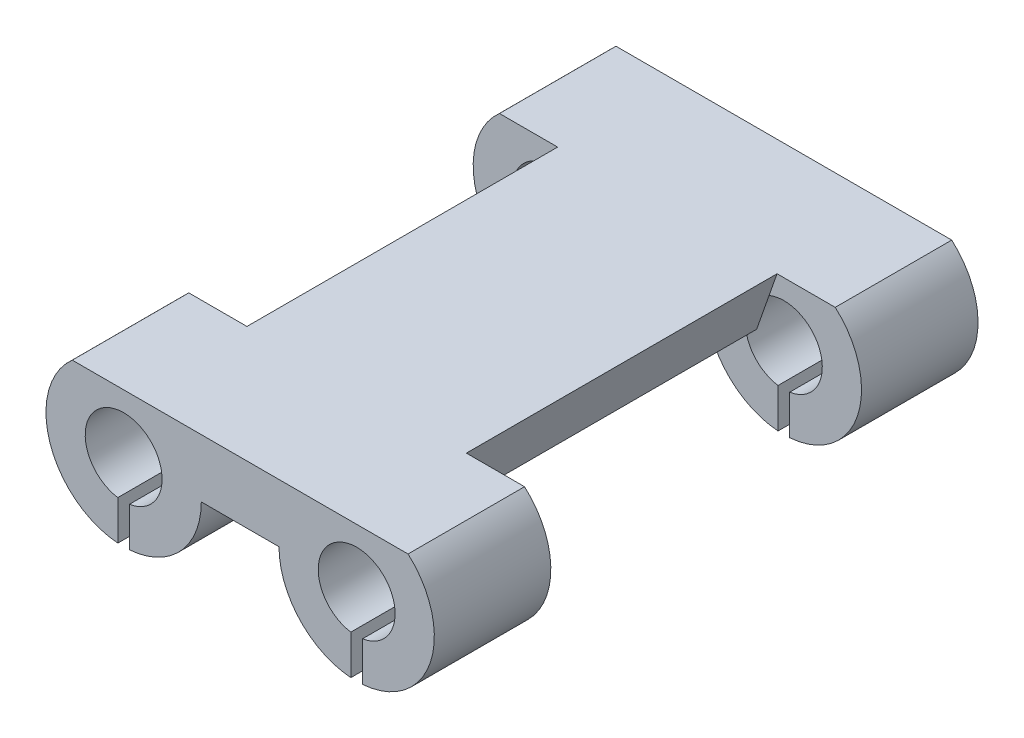
ISO-10303-21;
HEADER;
FILE_DESCRIPTION(('STEP AP214'),'2;1');
FILE_NAME('part.step','',(''),(''),'','','');
FILE_SCHEMA(('AUTOMOTIVE_DESIGN { 1 0 10303 214 1 1 1 1 }'));
ENDSEC;
DATA;
#1=APPLICATION_CONTEXT('core data for automotive mechanical design processes');
#2=APPLICATION_PROTOCOL_DEFINITION('international standard','automotive_design',2000,#1);
#3=PRODUCT_CONTEXT('',#1,'mechanical');
#4=PRODUCT('Part','Part','',(#3));
#5=PRODUCT_RELATED_PRODUCT_CATEGORY('part','',(#4));
#6=PRODUCT_DEFINITION_FORMATION('','',#4);
#7=PRODUCT_DEFINITION_CONTEXT('part definition',#1,'design');
#8=PRODUCT_DEFINITION('design','',#6,#7);
#9=PRODUCT_DEFINITION_SHAPE('','',#8);
#10=(LENGTH_UNIT() NAMED_UNIT(*) SI_UNIT(.MILLI.,.METRE.));
#11=(NAMED_UNIT(*) PLANE_ANGLE_UNIT() SI_UNIT($,.RADIAN.));
#12=(NAMED_UNIT(*) SI_UNIT($,.STERADIAN.) SOLID_ANGLE_UNIT());
#13=UNCERTAINTY_MEASURE_WITH_UNIT(LENGTH_MEASURE(1.E-05),#10,'distance_accuracy_value','');
#14=(GEOMETRIC_REPRESENTATION_CONTEXT(3) GLOBAL_UNCERTAINTY_ASSIGNED_CONTEXT((#13)) GLOBAL_UNIT_ASSIGNED_CONTEXT((#10,
#11,#12)) REPRESENTATION_CONTEXT('',''));
#15=CARTESIAN_POINT('',(0.,0.,0.));
#16=DIRECTION('',(0.,0.,1.));
#17=DIRECTION('',(1.,0.,0.));
#18=AXIS2_PLACEMENT_3D('',#15,#16,#17);
#19=CARTESIAN_POINT('',(15.,0.,15.));
#20=DIRECTION('',(0.,0.,1.));
#21=DIRECTION('',(1.,0.,0.));
#22=AXIS2_PLACEMENT_3D('',#19,#20,#21);
#23=PLANE('',#22);
#24=DIRECTION('',(0.,-1.,0.));
#25=VECTOR('',#24,1.);
#26=CARTESIAN_POINT('',(14.25,0.,15.));
#27=LINE('',#26,#25);
#28=CARTESIAN_POINT('',(14.25,-4.89285192909003,15.));
#29=VERTEX_POINT('',#28);
#30=CARTESIAN_POINT('',(14.25,-9.97183533758956,15.));
#31=VERTEX_POINT('',#30);
#32=EDGE_CURVE('E390',#29,#31,#27,.T.);
#33=ORIENTED_EDGE('',*,*,#32,.F.);
#34=CARTESIAN_POINT('',(15.,0.,15.));
#35=DIRECTION('',(0.,0.,-1.));
#36=DIRECTION('',(-1.,0.,0.));
#37=AXIS2_PLACEMENT_3D('',#34,#35,#36);
#38=CIRCLE('',#37,4.95);
#39=CARTESIAN_POINT('',(10.05,0.,15.));
#40=VERTEX_POINT('',#39);
#41=EDGE_CURVE('E459',#29,#40,#38,.T.);
#42=ORIENTED_EDGE('',*,*,#41,.T.);
#43=DIRECTION('',(1.,0.,0.));
#44=VECTOR('',#43,1.);
#45=CARTESIAN_POINT('',(11.5,0.,15.));
#46=LINE('',#45,#44);
#47=CARTESIAN_POINT('',(5.,0.,15.));
#48=VERTEX_POINT('',#47);
#49=EDGE_CURVE('E278',#48,#40,#46,.T.);
#50=ORIENTED_EDGE('',*,*,#49,.F.);
#51=CARTESIAN_POINT('',(15.,0.,15.));
#52=DIRECTION('',(0.,0.,1.));
#53=DIRECTION('',(1.,0.,0.));
#54=AXIS2_PLACEMENT_3D('',#51,#52,#53);
#55=CIRCLE('',#54,10.);
#56=EDGE_CURVE('E366',#48,#31,#55,.T.);
#57=ORIENTED_EDGE('',*,*,#56,.T.);
#58=EDGE_LOOP('',(#33,#42,#50,#57));
#59=FACE_BOUND('',#58,.T.);
#60=ADVANCED_FACE('F32',(#59),#23,.T.);
#61=CARTESIAN_POINT('',(15.,0.,15.));
#62=DIRECTION('',(0.,0.,-1.));
#63=DIRECTION('',(-1.,0.,0.));
#64=AXIS2_PLACEMENT_3D('',#61,#62,#63);
#65=CYLINDRICAL_SURFACE('',#64,10.);
#66=CARTESIAN_POINT('',(15.,0.,0.));
#67=DIRECTION('',(0.,0.,1.));
#68=DIRECTION('',(1.,0.,0.));
#69=AXIS2_PLACEMENT_3D('',#66,#67,#68);
#70=CIRCLE('',#69,10.);
#71=CARTESIAN_POINT('',(5.,0.,0.));
#72=VERTEX_POINT('',#71);
#73=CARTESIAN_POINT('',(14.25,-9.97183533758956,0.));
#74=VERTEX_POINT('',#73);
#75=EDGE_CURVE('E268',#72,#74,#70,.T.);
#76=ORIENTED_EDGE('',*,*,#75,.T.);
#77=DIRECTION('',(0.,0.,-1.));
#78=VECTOR('',#77,1.);
#79=CARTESIAN_POINT('',(14.25,-9.97183533758956,15.));
#80=LINE('',#79,#78);
#81=EDGE_CURVE('E394',#74,#31,#80,.F.);
#82=ORIENTED_EDGE('',*,*,#81,.T.);
#83=ORIENTED_EDGE('',*,*,#56,.F.);
#84=DIRECTION('',(0.,0.,-1.));
#85=VECTOR('',#84,1.);
#86=CARTESIAN_POINT('',(5.,0.,15.));
#87=LINE('',#86,#85);
#88=EDGE_CURVE('E376',#48,#72,#87,.T.);
#89=ORIENTED_EDGE('',*,*,#88,.T.);
#90=EDGE_LOOP('',(#76,#82,#83,#89));
#91=FACE_BOUND('',#90,.T.);
#92=ADVANCED_FACE('F393',(#91),#65,.T.);
#93=CARTESIAN_POINT('',(15.,0.,55.));
#94=DIRECTION('',(0.,0.,1.));
#95=DIRECTION('',(1.,0.,0.));
#96=AXIS2_PLACEMENT_3D('',#93,#94,#95);
#97=PLANE('',#96);
#98=CARTESIAN_POINT('',(15.,0.,55.));
#99=DIRECTION('',(0.,0.,1.));
#100=DIRECTION('',(1.,0.,0.));
#101=AXIS2_PLACEMENT_3D('',#98,#99,#100);
#102=CIRCLE('',#101,4.95);
#103=CARTESIAN_POINT('',(10.05,0.,55.));
#104=VERTEX_POINT('',#103);
#105=CARTESIAN_POINT('',(14.25,-4.89285192909003,55.));
#106=VERTEX_POINT('',#105);
#107=EDGE_CURVE('E443',#104,#106,#102,.T.);
#108=ORIENTED_EDGE('',*,*,#107,.T.);
#109=DIRECTION('',(0.,-1.,0.));
#110=VECTOR('',#109,1.);
#111=CARTESIAN_POINT('',(14.25,0.,55.));
#112=LINE('',#111,#110);
#113=CARTESIAN_POINT('',(14.25,-9.97183533758956,55.));
#114=VERTEX_POINT('',#113);
#115=EDGE_CURVE('E530',#106,#114,#112,.T.);
#116=ORIENTED_EDGE('',*,*,#115,.T.);
#117=CARTESIAN_POINT('',(15.,0.,55.));
#118=DIRECTION('',(0.,0.,1.));
#119=DIRECTION('',(1.,0.,0.));
#120=AXIS2_PLACEMENT_3D('',#117,#118,#119);
#121=CIRCLE('',#120,10.);
#122=CARTESIAN_POINT('',(5.,0.,55.));
#123=VERTEX_POINT('',#122);
#124=EDGE_CURVE('E924',#123,#114,#121,.T.);
#125=ORIENTED_EDGE('',*,*,#124,.F.);
#126=DIRECTION('',(1.,0.,0.));
#127=VECTOR('',#126,1.);
#128=CARTESIAN_POINT('',(11.5,0.,55.));
#129=LINE('',#128,#127);
#130=EDGE_CURVE('E328',#123,#104,#129,.T.);
#131=ORIENTED_EDGE('',*,*,#130,.T.);
#132=EDGE_LOOP('',(#108,#116,#125,#131));
#133=FACE_BOUND('',#132,.T.);
#134=ADVANCED_FACE('F588',(#133),#97,.F.);
#135=CARTESIAN_POINT('',(15.,0.,70.));
#136=DIRECTION('',(0.,0.,-1.));
#137=DIRECTION('',(-1.,0.,0.));
#138=AXIS2_PLACEMENT_3D('',#135,#136,#137);
#139=CYLINDRICAL_SURFACE('',#138,10.);
#140=ORIENTED_EDGE('',*,*,#124,.T.);
#141=DIRECTION('',(0.,0.,-1.));
#142=VECTOR('',#141,1.);
#143=CARTESIAN_POINT('',(14.25,-9.97183533758956,70.));
#144=LINE('',#143,#142);
#145=CARTESIAN_POINT('',(14.25,-9.97183533758956,70.));
#146=VERTEX_POINT('',#145);
#147=EDGE_CURVE('E533',#114,#146,#144,.F.);
#148=ORIENTED_EDGE('',*,*,#147,.T.);
#149=CARTESIAN_POINT('',(15.,0.,70.));
#150=DIRECTION('',(0.,0.,1.));
#151=DIRECTION('',(1.,0.,0.));
#152=AXIS2_PLACEMENT_3D('',#149,#150,#151);
#153=CIRCLE('',#152,10.);
#154=CARTESIAN_POINT('',(5.,0.,70.));
#155=VERTEX_POINT('',#154);
#156=EDGE_CURVE('E476',#155,#146,#153,.T.);
#157=ORIENTED_EDGE('',*,*,#156,.F.);
#158=DIRECTION('',(0.,0.,-1.));
#159=VECTOR('',#158,1.);
#160=CARTESIAN_POINT('',(5.,0.,70.));
#161=LINE('',#160,#159);
#162=EDGE_CURVE('E478',#155,#123,#161,.T.);
#163=ORIENTED_EDGE('',*,*,#162,.T.);
#164=EDGE_LOOP('',(#140,#148,#157,#163));
#165=FACE_BOUND('',#164,.T.);
#166=ADVANCED_FACE('F583',(#165),#139,.T.);
#167=CARTESIAN_POINT('',(-15.,0.,15.));
#168=DIRECTION('',(0.,0.,-1.));
#169=DIRECTION('',(-1.,0.,0.));
#170=AXIS2_PLACEMENT_3D('',#167,#168,#169);
#171=CYLINDRICAL_SURFACE('',#170,10.);
#172=CARTESIAN_POINT('',(-15.,0.,15.));
#173=DIRECTION('',(0.,0.,1.));
#174=DIRECTION('',(1.,0.,0.));
#175=AXIS2_PLACEMENT_3D('',#172,#173,#174);
#176=CIRCLE('',#175,10.);
#177=CARTESIAN_POINT('',(-21.6143782776615,7.5,15.));
#178=VERTEX_POINT('',#177);
#179=CARTESIAN_POINT('',(-15.75,-9.97183533758957,15.));
#180=VERTEX_POINT('',#179);
#181=EDGE_CURVE('E36',#178,#180,#176,.T.);
#182=ORIENTED_EDGE('',*,*,#181,.F.);
#183=DIRECTION('',(0.,0.,-1.));
#184=VECTOR('',#183,1.);
#185=CARTESIAN_POINT('',(-21.6143782776615,7.5,15.));
#186=LINE('',#185,#184);
#187=CARTESIAN_POINT('',(-21.6143782776615,7.5,0.));
#188=VERTEX_POINT('',#187);
#189=EDGE_CURVE('E513',#178,#188,#186,.T.);
#190=ORIENTED_EDGE('',*,*,#189,.T.);
#191=CARTESIAN_POINT('',(-15.,0.,0.));
#192=DIRECTION('',(0.,0.,1.));
#193=DIRECTION('',(1.,0.,0.));
#194=AXIS2_PLACEMENT_3D('',#191,#192,#193);
#195=CIRCLE('',#194,10.);
#196=CARTESIAN_POINT('',(-15.75,-9.97183533758957,0.));
#197=VERTEX_POINT('',#196);
#198=EDGE_CURVE('E262',#188,#197,#195,.T.);
#199=ORIENTED_EDGE('',*,*,#198,.T.);
#200=DIRECTION('',(0.,0.,-1.));
#201=VECTOR('',#200,1.);
#202=CARTESIAN_POINT('',(-15.75,-9.97183533758957,15.));
#203=LINE('',#202,#201);
#204=EDGE_CURVE('E436',#197,#180,#203,.F.);
#205=ORIENTED_EDGE('',*,*,#204,.T.);
#206=EDGE_LOOP('',(#182,#190,#199,#205));
#207=FACE_BOUND('',#206,.T.);
#208=ADVANCED_FACE('F575',(#207),#171,.T.);
#209=DIRECTION('',(1.,0.,0.));
#210=VECTOR('',#209,1.);
#211=CARTESIAN_POINT('',(15.,7.49999999999999,15.));
#212=LINE('',#211,#210);
#213=CARTESIAN_POINT('',(-14.125,7.5,15.));
#214=VERTEX_POINT('',#213);
#215=EDGE_CURVE('E252',#178,#214,#212,.T.);
#216=ORIENTED_EDGE('',*,*,#215,.F.);
#217=ORIENTED_EDGE('',*,*,#181,.T.);
#218=DIRECTION('',(0.,-1.,0.));
#219=VECTOR('',#218,1.);
#220=CARTESIAN_POINT('',(-15.75,0.,15.));
#221=LINE('',#220,#219);
#222=CARTESIAN_POINT('',(-15.75,-4.89285192909003,15.));
#223=VERTEX_POINT('',#222);
#224=EDGE_CURVE('E433',#223,#180,#221,.T.);
#225=ORIENTED_EDGE('',*,*,#224,.F.);
#226=CARTESIAN_POINT('',(-15.,0.,15.));
#227=DIRECTION('',(0.,0.,-1.));
#228=DIRECTION('',(-1.,0.,0.));
#229=AXIS2_PLACEMENT_3D('',#226,#227,#228);
#230=CIRCLE('',#229,4.95);
#231=CARTESIAN_POINT('',(-13.0997554151948,4.57072975769936,15.));
#232=VERTEX_POINT('',#231);
#233=EDGE_CURVE('E468',#223,#232,#230,.T.);
#234=ORIENTED_EDGE('',*,*,#233,.T.);
#235=DIRECTION('',(0.330350424728109,-0.943858356366016,0.));
#236=VECTOR('',#235,1.);
#237=CARTESIAN_POINT('',(-11.5,0.,15.));
#238=LINE('',#237,#236);
#239=EDGE_CURVE('E318',#214,#232,#238,.T.);
#240=ORIENTED_EDGE('',*,*,#239,.F.);
#241=EDGE_LOOP('',(#216,#217,#225,#234,#240));
#242=FACE_BOUND('',#241,.T.);
#243=ADVANCED_FACE('F565',(#242),#23,.T.);
#244=CARTESIAN_POINT('',(-15.,0.,55.));
#245=DIRECTION('',(0.,0.,1.));
#246=DIRECTION('',(1.,0.,0.));
#247=AXIS2_PLACEMENT_3D('',#244,#245,#246);
#248=CIRCLE('',#247,10.);
#249=CARTESIAN_POINT('',(-21.6143782776615,7.5,55.));
#250=VERTEX_POINT('',#249);
#251=CARTESIAN_POINT('',(-15.75,-9.97183533758957,55.));
#252=VERTEX_POINT('',#251);
#253=EDGE_CURVE('E351',#250,#252,#248,.T.);
#254=ORIENTED_EDGE('',*,*,#253,.F.);
#255=DIRECTION('',(1.,0.,0.));
#256=VECTOR('',#255,1.);
#257=CARTESIAN_POINT('',(15.,7.49999999999999,55.));
#258=LINE('',#257,#256);
#259=CARTESIAN_POINT('',(-14.125,7.5,55.));
#260=VERTEX_POINT('',#259);
#261=EDGE_CURVE('E507',#250,#260,#258,.T.);
#262=ORIENTED_EDGE('',*,*,#261,.T.);
#263=DIRECTION('',(0.330350424728109,-0.943858356366016,0.));
#264=VECTOR('',#263,1.);
#265=CARTESIAN_POINT('',(-11.5,0.,55.));
#266=LINE('',#265,#264);
#267=CARTESIAN_POINT('',(-13.0997554151948,4.57072975769936,55.));
#268=VERTEX_POINT('',#267);
#269=EDGE_CURVE('E323',#260,#268,#266,.T.);
#270=ORIENTED_EDGE('',*,*,#269,.T.);
#271=CARTESIAN_POINT('',(-15.,0.,55.));
#272=DIRECTION('',(0.,0.,1.));
#273=DIRECTION('',(1.,0.,0.));
#274=AXIS2_PLACEMENT_3D('',#271,#272,#273);
#275=CIRCLE('',#274,4.95);
#276=CARTESIAN_POINT('',(-15.75,-4.89285192909003,55.));
#277=VERTEX_POINT('',#276);
#278=EDGE_CURVE('E451',#268,#277,#275,.T.);
#279=ORIENTED_EDGE('',*,*,#278,.T.);
#280=DIRECTION('',(0.,-1.,0.));
#281=VECTOR('',#280,1.);
#282=CARTESIAN_POINT('',(-15.75,0.,55.));
#283=LINE('',#282,#281);
#284=EDGE_CURVE('E422',#277,#252,#283,.T.);
#285=ORIENTED_EDGE('',*,*,#284,.T.);
#286=EDGE_LOOP('',(#254,#262,#270,#279,#285));
#287=FACE_BOUND('',#286,.T.);
#288=ADVANCED_FACE('F593',(#287),#97,.F.);
#289=CARTESIAN_POINT('',(-15.,0.,70.));
#290=DIRECTION('',(0.,0.,-1.));
#291=DIRECTION('',(-1.,0.,0.));
#292=AXIS2_PLACEMENT_3D('',#289,#290,#291);
#293=CYLINDRICAL_SURFACE('',#292,10.);
#294=CARTESIAN_POINT('',(-15.,0.,70.));
#295=DIRECTION('',(0.,0.,1.));
#296=DIRECTION('',(1.,0.,0.));
#297=AXIS2_PLACEMENT_3D('',#294,#295,#296);
#298=CIRCLE('',#297,10.);
#299=CARTESIAN_POINT('',(-21.6143782776615,7.5,70.));
#300=VERTEX_POINT('',#299);
#301=CARTESIAN_POINT('',(-15.75,-9.97183533758957,70.));
#302=VERTEX_POINT('',#301);
#303=EDGE_CURVE('E471',#300,#302,#298,.T.);
#304=ORIENTED_EDGE('',*,*,#303,.F.);
#305=DIRECTION('',(0.,0.,-1.));
#306=VECTOR('',#305,1.);
#307=CARTESIAN_POINT('',(-21.6143782776615,7.5,70.));
#308=LINE('',#307,#306);
#309=EDGE_CURVE('E49',#300,#250,#308,.T.);
#310=ORIENTED_EDGE('',*,*,#309,.T.);
#311=ORIENTED_EDGE('',*,*,#253,.T.);
#312=DIRECTION('',(0.,0.,-1.));
#313=VECTOR('',#312,1.);
#314=CARTESIAN_POINT('',(-15.75,-9.97183533758957,70.));
#315=LINE('',#314,#313);
#316=EDGE_CURVE('E425',#252,#302,#315,.F.);
#317=ORIENTED_EDGE('',*,*,#316,.T.);
#318=EDGE_LOOP('',(#304,#310,#311,#317));
#319=FACE_BOUND('',#318,.T.);
#320=ADVANCED_FACE('F580',(#319),#293,.T.);
#321=DIRECTION('',(1.,0.,0.));
#322=VECTOR('',#321,1.);
#323=CARTESIAN_POINT('',(15.,7.49999999999999,15.));
#324=LINE('',#323,#322);
#325=CARTESIAN_POINT('',(14.125,7.49999999999999,15.));
#326=VERTEX_POINT('',#325);
#327=CARTESIAN_POINT('',(21.6143782776615,7.49999999999999,15.));
#328=VERTEX_POINT('',#327);
#329=EDGE_CURVE('E247',#326,#328,#324,.T.);
#330=ORIENTED_EDGE('',*,*,#329,.F.);
#331=DIRECTION('',(0.330350424728106,0.943858356366017,0.));
#332=VECTOR('',#331,1.);
#333=CARTESIAN_POINT('',(15.,10.,15.));
#334=LINE('',#333,#332);
#335=CARTESIAN_POINT('',(13.0997554151948,4.57072975769936,15.));
#336=VERTEX_POINT('',#335);
#337=EDGE_CURVE('E287',#336,#326,#334,.T.);
#338=ORIENTED_EDGE('',*,*,#337,.F.);
#339=CARTESIAN_POINT('',(15.75,-4.89285192909003,15.));
#340=VERTEX_POINT('',#339);
#341=EDGE_CURVE('E458',#336,#340,#38,.T.);
#342=ORIENTED_EDGE('',*,*,#341,.T.);
#343=DIRECTION('',(0.,1.,0.));
#344=VECTOR('',#343,1.);
#345=CARTESIAN_POINT('',(15.75,0.,15.));
#346=LINE('',#345,#344);
#347=CARTESIAN_POINT('',(15.75,-9.97183533758956,15.));
#348=VERTEX_POINT('',#347);
#349=EDGE_CURVE('E528',#348,#340,#346,.T.);
#350=ORIENTED_EDGE('',*,*,#349,.F.);
#351=EDGE_CURVE('E363',#348,#328,#55,.T.);
#352=ORIENTED_EDGE('',*,*,#351,.T.);
#353=EDGE_LOOP('',(#330,#338,#342,#350,#352));
#354=FACE_BOUND('',#353,.T.);
#355=ADVANCED_FACE('F546',(#354),#23,.T.);
#356=CARTESIAN_POINT('',(-14.25,-9.97183533758957,15.));
#357=VERTEX_POINT('',#356);
#358=CARTESIAN_POINT('',(-5.,0.,15.));
#359=VERTEX_POINT('',#358);
#360=EDGE_CURVE('E272',#357,#359,#176,.T.);
#361=ORIENTED_EDGE('',*,*,#360,.F.);
#362=DIRECTION('',(0.,0.,-1.));
#363=VECTOR('',#362,1.);
#364=CARTESIAN_POINT('',(-14.25,-9.97183533758957,15.));
#365=LINE('',#364,#363);
#366=CARTESIAN_POINT('',(-14.25,-9.97183533758957,0.));
#367=VERTEX_POINT('',#366);
#368=EDGE_CURVE('E420',#357,#367,#365,.T.);
#369=ORIENTED_EDGE('',*,*,#368,.T.);
#370=CARTESIAN_POINT('',(-5.,0.,0.));
#371=VERTEX_POINT('',#370);
#372=EDGE_CURVE('E291',#367,#371,#195,.T.);
#373=ORIENTED_EDGE('',*,*,#372,.T.);
#374=DIRECTION('',(0.,0.,-1.));
#375=VECTOR('',#374,1.);
#376=CARTESIAN_POINT('',(-5.,0.,15.));
#377=LINE('',#376,#375);
#378=EDGE_CURVE('E374',#359,#371,#377,.T.);
#379=ORIENTED_EDGE('',*,*,#378,.F.);
#380=EDGE_LOOP('',(#361,#369,#373,#379));
#381=FACE_BOUND('',#380,.T.);
#382=ADVANCED_FACE('F34',(#381),#171,.T.);
#383=CARTESIAN_POINT('',(-5.,0.,15.));
#384=DIRECTION('',(0.,1.,0.));
#385=DIRECTION('',(0.,0.,1.));
#386=AXIS2_PLACEMENT_3D('',#383,#384,#385);
#387=PLANE('',#386);
#388=DIRECTION('',(1.,0.,0.));
#389=VECTOR('',#388,1.);
#390=CARTESIAN_POINT('',(-5.,0.,0.));
#391=LINE('',#390,#389);
#392=EDGE_CURVE('E269',#371,#72,#391,.T.);
#393=ORIENTED_EDGE('',*,*,#392,.T.);
#394=ORIENTED_EDGE('',*,*,#88,.F.);
#395=ORIENTED_EDGE('',*,*,#49,.T.);
#396=DIRECTION('',(-1.,0.,0.));
#397=VECTOR('',#396,1.);
#398=CARTESIAN_POINT('',(-5.,0.,15.));
#399=LINE('',#398,#397);
#400=CARTESIAN_POINT('',(11.5,0.,15.));
#401=VERTEX_POINT('',#400);
#402=EDGE_CURVE('E457',#401,#40,#399,.T.);
#403=ORIENTED_EDGE('',*,*,#402,.F.);
#404=DIRECTION('',(0.,0.,-1.));
#405=VECTOR('',#404,1.);
#406=CARTESIAN_POINT('',(11.5,0.,55.));
#407=LINE('',#406,#405);
#408=CARTESIAN_POINT('',(11.5,0.,55.));
#409=VERTEX_POINT('',#408);
#410=EDGE_CURVE('E301',#409,#401,#407,.T.);
#411=ORIENTED_EDGE('',*,*,#410,.F.);
#412=EDGE_CURVE('E339',#104,#409,#129,.T.);
#413=ORIENTED_EDGE('',*,*,#412,.F.);
#414=ORIENTED_EDGE('',*,*,#130,.F.);
#415=ORIENTED_EDGE('',*,*,#162,.F.);
#416=DIRECTION('',(1.,0.,0.));
#417=VECTOR('',#416,1.);
#418=CARTESIAN_POINT('',(-5.,0.,70.));
#419=LINE('',#418,#417);
#420=CARTESIAN_POINT('',(-5.,0.,70.));
#421=VERTEX_POINT('',#420);
#422=EDGE_CURVE('E473',#421,#155,#419,.T.);
#423=ORIENTED_EDGE('',*,*,#422,.F.);
#424=DIRECTION('',(0.,0.,-1.));
#425=VECTOR('',#424,1.);
#426=CARTESIAN_POINT('',(-5.,0.,70.));
#427=LINE('',#426,#425);
#428=CARTESIAN_POINT('',(-5.,0.,55.));
#429=VERTEX_POINT('',#428);
#430=EDGE_CURVE('E359',#421,#429,#427,.T.);
#431=ORIENTED_EDGE('',*,*,#430,.T.);
#432=CARTESIAN_POINT('',(-10.05,0.,55.));
#433=VERTEX_POINT('',#432);
#434=EDGE_CURVE('E336',#433,#429,#129,.T.);
#435=ORIENTED_EDGE('',*,*,#434,.F.);
#436=CARTESIAN_POINT('',(-11.5,0.,55.));
#437=VERTEX_POINT('',#436);
#438=EDGE_CURVE('E333',#437,#433,#129,.T.);
#439=ORIENTED_EDGE('',*,*,#438,.F.);
#440=DIRECTION('',(0.,0.,-1.));
#441=VECTOR('',#440,1.);
#442=CARTESIAN_POINT('',(-11.5,0.,55.));
#443=LINE('',#442,#441);
#444=CARTESIAN_POINT('',(-11.5,0.,15.));
#445=VERTEX_POINT('',#444);
#446=EDGE_CURVE('E289',#437,#445,#443,.T.);
#447=ORIENTED_EDGE('',*,*,#446,.T.);
#448=CARTESIAN_POINT('',(-10.05,0.,15.));
#449=VERTEX_POINT('',#448);
#450=EDGE_CURVE('E284',#445,#449,#46,.T.);
#451=ORIENTED_EDGE('',*,*,#450,.T.);
#452=EDGE_CURVE('E288',#449,#359,#46,.T.);
#453=ORIENTED_EDGE('',*,*,#452,.T.);
#454=ORIENTED_EDGE('',*,*,#378,.T.);
#455=EDGE_LOOP('',(#393,#394,#395,#403,#411,#413,#414,#415,#423,#431,#435,#439,#447,#451,#453,#454));
#456=FACE_BOUND('',#455,.T.);
#457=ADVANCED_FACE('F551',(#456),#387,.F.);
#458=CARTESIAN_POINT('',(15.75,-9.97183533758956,0.));
#459=VERTEX_POINT('',#458);
#460=CARTESIAN_POINT('',(21.6143782776615,7.49999999999999,0.));
#461=VERTEX_POINT('',#460);
#462=EDGE_CURVE('E260',#459,#461,#70,.T.);
#463=ORIENTED_EDGE('',*,*,#462,.T.);
#464=DIRECTION('',(0.,0.,-1.));
#465=VECTOR('',#464,1.);
#466=CARTESIAN_POINT('',(21.6143782776615,7.49999999999999,15.));
#467=LINE('',#466,#465);
#468=EDGE_CURVE('E241',#461,#328,#467,.F.);
#469=ORIENTED_EDGE('',*,*,#468,.T.);
#470=ORIENTED_EDGE('',*,*,#351,.F.);
#471=DIRECTION('',(0.,0.,-1.));
#472=VECTOR('',#471,1.);
#473=CARTESIAN_POINT('',(15.75,-9.97183533758956,15.));
#474=LINE('',#473,#472);
#475=EDGE_CURVE('E267',#348,#459,#474,.T.);
#476=ORIENTED_EDGE('',*,*,#475,.T.);
#477=EDGE_LOOP('',(#463,#469,#470,#476));
#478=FACE_BOUND('',#477,.T.);
#479=ADVANCED_FACE('F266',(#478),#65,.T.);
#480=DIRECTION('',(0.,1.,0.));
#481=VECTOR('',#480,1.);
#482=CARTESIAN_POINT('',(-14.25,0.,15.));
#483=LINE('',#482,#481);
#484=CARTESIAN_POINT('',(-14.25,-4.89285192909003,15.));
#485=VERTEX_POINT('',#484);
#486=EDGE_CURVE('E418',#357,#485,#483,.T.);
#487=ORIENTED_EDGE('',*,*,#486,.F.);
#488=ORIENTED_EDGE('',*,*,#360,.T.);
#489=ORIENTED_EDGE('',*,*,#452,.F.);
#490=EDGE_CURVE('E467',#449,#485,#230,.T.);
#491=ORIENTED_EDGE('',*,*,#490,.T.);
#492=EDGE_LOOP('',(#487,#488,#489,#491));
#493=FACE_BOUND('',#492,.T.);
#494=ADVANCED_FACE('F573',(#493),#23,.T.);
#495=CARTESIAN_POINT('',(15.,0.,0.));
#496=DIRECTION('',(0.,0.,1.));
#497=DIRECTION('',(1.,0.,0.));
#498=AXIS2_PLACEMENT_3D('',#495,#496,#497);
#499=PLANE('',#498);
#500=ORIENTED_EDGE('',*,*,#198,.F.);
#501=DIRECTION('',(-1.,0.,0.));
#502=VECTOR('',#501,1.);
#503=CARTESIAN_POINT('',(-25.,7.5,0.));
#504=LINE('',#503,#502);
#505=EDGE_CURVE('E244',#461,#188,#504,.T.);
#506=ORIENTED_EDGE('',*,*,#505,.F.);
#507=ORIENTED_EDGE('',*,*,#462,.F.);
#508=DIRECTION('',(0.,1.,0.));
#509=VECTOR('',#508,1.);
#510=CARTESIAN_POINT('',(15.75,0.,0.));
#511=LINE('',#510,#509);
#512=CARTESIAN_POINT('',(15.75,-4.89285192909003,0.));
#513=VERTEX_POINT('',#512);
#514=EDGE_CURVE('E525',#459,#513,#511,.T.);
#515=ORIENTED_EDGE('',*,*,#514,.T.);
#516=CARTESIAN_POINT('',(15.,0.,0.));
#517=DIRECTION('',(0.,0.,-1.));
#518=DIRECTION('',(-1.,0.,0.));
#519=AXIS2_PLACEMENT_3D('',#516,#517,#518);
#520=CIRCLE('',#519,4.95);
#521=CARTESIAN_POINT('',(14.25,-4.89285192909003,0.));
#522=VERTEX_POINT('',#521);
#523=EDGE_CURVE('E450',#522,#513,#520,.T.);
#524=ORIENTED_EDGE('',*,*,#523,.F.);
#525=DIRECTION('',(0.,-1.,0.));
#526=VECTOR('',#525,1.);
#527=CARTESIAN_POINT('',(14.25,0.,0.));
#528=LINE('',#527,#526);
#529=EDGE_CURVE('E57',#522,#74,#528,.T.);
#530=ORIENTED_EDGE('',*,*,#529,.T.);
#531=ORIENTED_EDGE('',*,*,#75,.F.);
#532=ORIENTED_EDGE('',*,*,#392,.F.);
#533=ORIENTED_EDGE('',*,*,#372,.F.);
#534=DIRECTION('',(0.,1.,0.));
#535=VECTOR('',#534,1.);
#536=CARTESIAN_POINT('',(-14.25,0.,0.));
#537=LINE('',#536,#535);
#538=CARTESIAN_POINT('',(-14.25,-4.89285192909003,0.));
#539=VERTEX_POINT('',#538);
#540=EDGE_CURVE('E415',#367,#539,#537,.T.);
#541=ORIENTED_EDGE('',*,*,#540,.T.);
#542=CARTESIAN_POINT('',(-15.,0.,0.));
#543=DIRECTION('',(0.,0.,-1.));
#544=DIRECTION('',(-1.,0.,0.));
#545=AXIS2_PLACEMENT_3D('',#542,#543,#544);
#546=CIRCLE('',#545,4.95);
#547=CARTESIAN_POINT('',(-15.75,-4.89285192909003,0.));
#548=VERTEX_POINT('',#547);
#549=EDGE_CURVE('E464',#548,#539,#546,.T.);
#550=ORIENTED_EDGE('',*,*,#549,.F.);
#551=DIRECTION('',(0.,-1.,0.));
#552=VECTOR('',#551,1.);
#553=CARTESIAN_POINT('',(-15.75,0.,0.));
#554=LINE('',#553,#552);
#555=EDGE_CURVE('E431',#548,#197,#554,.T.);
#556=ORIENTED_EDGE('',*,*,#555,.T.);
#557=EDGE_LOOP('',(#500,#506,#507,#515,#524,#530,#531,#532,#533,#541,#550,#556));
#558=FACE_BOUND('',#557,.T.);
#559=ADVANCED_FACE('F258',(#558),#499,.F.);
#560=CARTESIAN_POINT('',(-11.5,0.,55.));
#561=DIRECTION('',(0.943858356366016,0.330350424728109,0.));
#562=DIRECTION('',(-0.330350424728109,0.943858356366016,0.));
#563=AXIS2_PLACEMENT_3D('',#560,#561,#562);
#564=PLANE('',#563);
#565=ORIENTED_EDGE('',*,*,#269,.F.);
#566=DIRECTION('',(0.,0.,-1.));
#567=VECTOR('',#566,1.);
#568=CARTESIAN_POINT('',(-14.125,7.5,55.));
#569=LINE('',#568,#567);
#570=EDGE_CURVE('E253',#260,#214,#569,.T.);
#571=ORIENTED_EDGE('',*,*,#570,.T.);
#572=ORIENTED_EDGE('',*,*,#239,.T.);
#573=EDGE_CURVE('E319',#232,#445,#238,.T.);
#574=ORIENTED_EDGE('',*,*,#573,.T.);
#575=ORIENTED_EDGE('',*,*,#446,.F.);
#576=EDGE_CURVE('E317',#268,#437,#266,.T.);
#577=ORIENTED_EDGE('',*,*,#576,.F.);
#578=EDGE_LOOP('',(#565,#571,#572,#574,#575,#577));
#579=FACE_BOUND('',#578,.T.);
#580=ADVANCED_FACE('F599',(#579),#564,.F.);
#581=CARTESIAN_POINT('',(15.,10.,55.));
#582=DIRECTION('',(-0.943858356366017,0.330350424728106,0.));
#583=DIRECTION('',(-0.330350424728106,-0.943858356366017,0.));
#584=AXIS2_PLACEMENT_3D('',#581,#582,#583);
#585=PLANE('',#584);
#586=ORIENTED_EDGE('',*,*,#337,.T.);
#587=DIRECTION('',(0.,0.,1.));
#588=VECTOR('',#587,1.);
#589=CARTESIAN_POINT('',(14.125,7.49999999999999,55.));
#590=LINE('',#589,#588);
#591=CARTESIAN_POINT('',(14.125,7.49999999999999,55.));
#592=VERTEX_POINT('',#591);
#593=EDGE_CURVE('E500',#326,#592,#590,.T.);
#594=ORIENTED_EDGE('',*,*,#593,.T.);
#595=DIRECTION('',(0.330350424728106,0.943858356366017,0.));
#596=VECTOR('',#595,1.);
#597=CARTESIAN_POINT('',(15.,10.,55.));
#598=LINE('',#597,#596);
#599=CARTESIAN_POINT('',(13.0997554151948,4.57072975769936,55.));
#600=VERTEX_POINT('',#599);
#601=EDGE_CURVE('E312',#600,#592,#598,.T.);
#602=ORIENTED_EDGE('',*,*,#601,.F.);
#603=EDGE_CURVE('E306',#409,#600,#598,.T.);
#604=ORIENTED_EDGE('',*,*,#603,.F.);
#605=ORIENTED_EDGE('',*,*,#410,.T.);
#606=EDGE_CURVE('E315',#401,#336,#334,.T.);
#607=ORIENTED_EDGE('',*,*,#606,.T.);
#608=EDGE_LOOP('',(#586,#594,#602,#604,#605,#607));
#609=FACE_BOUND('',#608,.T.);
#610=ADVANCED_FACE('F696',(#609),#585,.F.);
#611=CARTESIAN_POINT('',(-14.25,-9.97183533758957,55.));
#612=VERTEX_POINT('',#611);
#613=EDGE_CURVE('E348',#612,#429,#248,.T.);
#614=ORIENTED_EDGE('',*,*,#613,.F.);
#615=DIRECTION('',(0.,1.,0.));
#616=VECTOR('',#615,1.);
#617=CARTESIAN_POINT('',(-14.25,0.,55.));
#618=LINE('',#617,#616);
#619=CARTESIAN_POINT('',(-14.25,-4.89285192909003,55.));
#620=VERTEX_POINT('',#619);
#621=EDGE_CURVE('E406',#612,#620,#618,.T.);
#622=ORIENTED_EDGE('',*,*,#621,.T.);
#623=EDGE_CURVE('E452',#620,#433,#275,.T.);
#624=ORIENTED_EDGE('',*,*,#623,.T.);
#625=ORIENTED_EDGE('',*,*,#434,.T.);
#626=EDGE_LOOP('',(#614,#622,#624,#625));
#627=FACE_BOUND('',#626,.T.);
#628=ADVANCED_FACE('F667',(#627),#97,.F.);
#629=ORIENTED_EDGE('',*,*,#601,.T.);
#630=DIRECTION('',(1.,0.,0.));
#631=VECTOR('',#630,1.);
#632=CARTESIAN_POINT('',(15.,7.49999999999999,55.));
#633=LINE('',#632,#631);
#634=CARTESIAN_POINT('',(21.6143782776615,7.49999999999999,55.));
#635=VERTEX_POINT('',#634);
#636=EDGE_CURVE('E498',#592,#635,#633,.T.);
#637=ORIENTED_EDGE('',*,*,#636,.T.);
#638=CARTESIAN_POINT('',(15.75,-9.97183533758956,55.));
#639=VERTEX_POINT('',#638);
#640=EDGE_CURVE('E361',#639,#635,#121,.T.);
#641=ORIENTED_EDGE('',*,*,#640,.F.);
#642=DIRECTION('',(0.,1.,0.));
#643=VECTOR('',#642,1.);
#644=CARTESIAN_POINT('',(15.75,0.,55.));
#645=LINE('',#644,#643);
#646=CARTESIAN_POINT('',(15.75,-4.89285192909003,55.));
#647=VERTEX_POINT('',#646);
#648=EDGE_CURVE('E518',#639,#647,#645,.T.);
#649=ORIENTED_EDGE('',*,*,#648,.T.);
#650=EDGE_CURVE('E444',#647,#600,#102,.T.);
#651=ORIENTED_EDGE('',*,*,#650,.T.);
#652=EDGE_LOOP('',(#629,#637,#641,#649,#651));
#653=FACE_BOUND('',#652,.T.);
#654=ADVANCED_FACE('F695',(#653),#97,.F.);
#655=CARTESIAN_POINT('',(-14.25,-9.97183533758957,70.));
#656=VERTEX_POINT('',#655);
#657=EDGE_CURVE('E474',#656,#421,#298,.T.);
#658=ORIENTED_EDGE('',*,*,#657,.F.);
#659=DIRECTION('',(0.,0.,-1.));
#660=VECTOR('',#659,1.);
#661=CARTESIAN_POINT('',(-14.25,-9.97183533758957,70.));
#662=LINE('',#661,#660);
#663=EDGE_CURVE('E409',#656,#612,#662,.T.);
#664=ORIENTED_EDGE('',*,*,#663,.T.);
#665=ORIENTED_EDGE('',*,*,#613,.T.);
#666=ORIENTED_EDGE('',*,*,#430,.F.);
#667=EDGE_LOOP('',(#658,#664,#665,#666));
#668=FACE_BOUND('',#667,.T.);
#669=ADVANCED_FACE('F704',(#668),#293,.T.);
#670=ORIENTED_EDGE('',*,*,#640,.T.);
#671=DIRECTION('',(0.,0.,-1.));
#672=VECTOR('',#671,1.);
#673=CARTESIAN_POINT('',(21.6143782776615,7.49999999999999,70.));
#674=LINE('',#673,#672);
#675=CARTESIAN_POINT('',(21.6143782776615,7.49999999999999,70.));
#676=VERTEX_POINT('',#675);
#677=EDGE_CURVE('E263',#635,#676,#674,.F.);
#678=ORIENTED_EDGE('',*,*,#677,.T.);
#679=CARTESIAN_POINT('',(15.75,-9.97183533758956,70.));
#680=VERTEX_POINT('',#679);
#681=EDGE_CURVE('E475',#680,#676,#153,.T.);
#682=ORIENTED_EDGE('',*,*,#681,.F.);
#683=DIRECTION('',(0.,0.,-1.));
#684=VECTOR('',#683,1.);
#685=CARTESIAN_POINT('',(15.75,-9.97183533758956,70.));
#686=LINE('',#685,#684);
#687=EDGE_CURVE('E495',#680,#639,#686,.T.);
#688=ORIENTED_EDGE('',*,*,#687,.T.);
#689=EDGE_LOOP('',(#670,#678,#682,#688));
#690=FACE_BOUND('',#689,.T.);
#691=ADVANCED_FACE('F494',(#690),#139,.T.);
#692=CARTESIAN_POINT('',(15.,0.,70.));
#693=DIRECTION('',(0.,0.,1.));
#694=DIRECTION('',(1.,0.,0.));
#695=AXIS2_PLACEMENT_3D('',#692,#693,#694);
#696=PLANE('',#695);
#697=DIRECTION('',(1.,0.,0.));
#698=VECTOR('',#697,1.);
#699=CARTESIAN_POINT('',(15.,7.49999999999999,70.));
#700=LINE('',#699,#698);
#701=EDGE_CURVE('E11',#300,#676,#700,.T.);
#702=ORIENTED_EDGE('',*,*,#701,.F.);
#703=ORIENTED_EDGE('',*,*,#303,.T.);
#704=DIRECTION('',(0.,-1.,0.));
#705=VECTOR('',#704,1.);
#706=CARTESIAN_POINT('',(-15.75,0.,70.));
#707=LINE('',#706,#705);
#708=CARTESIAN_POINT('',(-15.75,-4.89285192909003,70.));
#709=VERTEX_POINT('',#708);
#710=EDGE_CURVE('E396',#709,#302,#707,.T.);
#711=ORIENTED_EDGE('',*,*,#710,.F.);
#712=CARTESIAN_POINT('',(-15.,0.,70.));
#713=DIRECTION('',(0.,0.,1.));
#714=DIRECTION('',(1.,0.,0.));
#715=AXIS2_PLACEMENT_3D('',#712,#713,#714);
#716=CIRCLE('',#715,4.95);
#717=CARTESIAN_POINT('',(-14.25,-4.89285192909003,70.));
#718=VERTEX_POINT('',#717);
#719=EDGE_CURVE('E442',#718,#709,#716,.T.);
#720=ORIENTED_EDGE('',*,*,#719,.F.);
#721=DIRECTION('',(0.,1.,0.));
#722=VECTOR('',#721,1.);
#723=CARTESIAN_POINT('',(-14.25,0.,70.));
#724=LINE('',#723,#722);
#725=EDGE_CURVE('E404',#656,#718,#724,.T.);
#726=ORIENTED_EDGE('',*,*,#725,.F.);
#727=ORIENTED_EDGE('',*,*,#657,.T.);
#728=ORIENTED_EDGE('',*,*,#422,.T.);
#729=ORIENTED_EDGE('',*,*,#156,.T.);
#730=DIRECTION('',(0.,-1.,0.));
#731=VECTOR('',#730,1.);
#732=CARTESIAN_POINT('',(14.25,0.,70.));
#733=LINE('',#732,#731);
#734=CARTESIAN_POINT('',(14.25,-4.89285192909003,70.));
#735=VERTEX_POINT('',#734);
#736=EDGE_CURVE('E515',#735,#146,#733,.T.);
#737=ORIENTED_EDGE('',*,*,#736,.F.);
#738=CARTESIAN_POINT('',(15.,0.,70.));
#739=DIRECTION('',(0.,0.,1.));
#740=DIRECTION('',(1.,0.,0.));
#741=AXIS2_PLACEMENT_3D('',#738,#739,#740);
#742=CIRCLE('',#741,4.95);
#743=CARTESIAN_POINT('',(15.75,-4.89285192909003,70.));
#744=VERTEX_POINT('',#743);
#745=EDGE_CURVE('E438',#744,#735,#742,.T.);
#746=ORIENTED_EDGE('',*,*,#745,.F.);
#747=DIRECTION('',(0.,1.,0.));
#748=VECTOR('',#747,1.);
#749=CARTESIAN_POINT('',(15.75,0.,70.));
#750=LINE('',#749,#748);
#751=EDGE_CURVE('E489',#680,#744,#750,.T.);
#752=ORIENTED_EDGE('',*,*,#751,.F.);
#753=ORIENTED_EDGE('',*,*,#681,.T.);
#754=EDGE_LOOP('',(#702,#703,#711,#720,#726,#727,#728,#729,#737,#746,#752,#753));
#755=FACE_BOUND('',#754,.T.);
#756=ADVANCED_FACE('F486',(#755),#696,.T.);
#757=CARTESIAN_POINT('',(-15.,0.,15.));
#758=DIRECTION('',(0.,0.,-1.));
#759=DIRECTION('',(-1.,0.,0.));
#760=AXIS2_PLACEMENT_3D('',#757,#758,#759);
#761=PLANE('',#760);
#762=ORIENTED_EDGE('',*,*,#450,.F.);
#763=ORIENTED_EDGE('',*,*,#573,.F.);
#764=EDGE_CURVE('E352',#232,#449,#230,.T.);
#765=ORIENTED_EDGE('',*,*,#764,.T.);
#766=EDGE_LOOP('',(#762,#763,#765));
#767=FACE_BOUND('',#766,.T.);
#768=ADVANCED_FACE('F720',(#767),#761,.T.);
#769=CARTESIAN_POINT('',(-15.,0.,15.));
#770=DIRECTION('',(0.,0.,-1.));
#771=DIRECTION('',(-1.,0.,0.));
#772=AXIS2_PLACEMENT_3D('',#769,#770,#771);
#773=CYLINDRICAL_SURFACE('',#772,4.95);
#774=ORIENTED_EDGE('',*,*,#233,.F.);
#775=DIRECTION('',(0.,0.,-1.));
#776=VECTOR('',#775,1.);
#777=CARTESIAN_POINT('',(-15.75,-4.89285192909003,15.));
#778=LINE('',#777,#776);
#779=EDGE_CURVE('E428',#223,#548,#778,.T.);
#780=ORIENTED_EDGE('',*,*,#779,.T.);
#781=ORIENTED_EDGE('',*,*,#549,.T.);
#782=DIRECTION('',(0.,0.,-1.));
#783=VECTOR('',#782,1.);
#784=CARTESIAN_POINT('',(-14.25,-4.89285192909003,15.));
#785=LINE('',#784,#783);
#786=EDGE_CURVE('E412',#539,#485,#785,.F.);
#787=ORIENTED_EDGE('',*,*,#786,.T.);
#788=ORIENTED_EDGE('',*,*,#490,.F.);
#789=ORIENTED_EDGE('',*,*,#764,.F.);
#790=EDGE_LOOP('',(#774,#780,#781,#787,#788,#789));
#791=FACE_BOUND('',#790,.T.);
#792=ADVANCED_FACE('F556',(#791),#773,.F.);
#793=CARTESIAN_POINT('',(15.,0.,15.));
#794=DIRECTION('',(0.,0.,-1.));
#795=DIRECTION('',(-1.,0.,0.));
#796=AXIS2_PLACEMENT_3D('',#793,#794,#795);
#797=PLANE('',#796);
#798=ORIENTED_EDGE('',*,*,#402,.T.);
#799=EDGE_CURVE('E455',#40,#336,#38,.T.);
#800=ORIENTED_EDGE('',*,*,#799,.T.);
#801=ORIENTED_EDGE('',*,*,#606,.F.);
#802=EDGE_LOOP('',(#798,#800,#801));
#803=FACE_BOUND('',#802,.T.);
#804=ADVANCED_FACE('F550',(#803),#797,.T.);
#805=CARTESIAN_POINT('',(15.,0.,15.));
#806=DIRECTION('',(0.,0.,-1.));
#807=DIRECTION('',(-1.,0.,0.));
#808=AXIS2_PLACEMENT_3D('',#805,#806,#807);
#809=CYLINDRICAL_SURFACE('',#808,4.95);
#810=ORIENTED_EDGE('',*,*,#41,.F.);
#811=DIRECTION('',(0.,0.,-1.));
#812=VECTOR('',#811,1.);
#813=CARTESIAN_POINT('',(14.25,-4.89285192909003,15.));
#814=LINE('',#813,#812);
#815=EDGE_CURVE('E398',#29,#522,#814,.T.);
#816=ORIENTED_EDGE('',*,*,#815,.T.);
#817=ORIENTED_EDGE('',*,*,#523,.T.);
#818=DIRECTION('',(0.,0.,-1.));
#819=VECTOR('',#818,1.);
#820=CARTESIAN_POINT('',(15.75,-4.89285192909003,15.));
#821=LINE('',#820,#819);
#822=EDGE_CURVE('E522',#513,#340,#821,.F.);
#823=ORIENTED_EDGE('',*,*,#822,.T.);
#824=ORIENTED_EDGE('',*,*,#341,.F.);
#825=ORIENTED_EDGE('',*,*,#799,.F.);
#826=EDGE_LOOP('',(#810,#816,#817,#823,#824,#825));
#827=FACE_BOUND('',#826,.T.);
#828=ADVANCED_FACE('F537',(#827),#809,.F.);
#829=CARTESIAN_POINT('',(-15.,0.,55.));
#830=DIRECTION('',(0.,0.,1.));
#831=DIRECTION('',(1.,0.,0.));
#832=AXIS2_PLACEMENT_3D('',#829,#830,#831);
#833=PLANE('',#832);
#834=ORIENTED_EDGE('',*,*,#438,.T.);
#835=EDGE_CURVE('E447',#433,#268,#275,.T.);
#836=ORIENTED_EDGE('',*,*,#835,.T.);
#837=ORIENTED_EDGE('',*,*,#576,.T.);
#838=EDGE_LOOP('',(#834,#836,#837));
#839=FACE_BOUND('',#838,.T.);
#840=ADVANCED_FACE('F621',(#839),#833,.T.);
#841=CARTESIAN_POINT('',(-15.,0.,55.));
#842=DIRECTION('',(0.,0.,1.));
#843=DIRECTION('',(1.,0.,0.));
#844=AXIS2_PLACEMENT_3D('',#841,#842,#843);
#845=CYLINDRICAL_SURFACE('',#844,4.95);
#846=ORIENTED_EDGE('',*,*,#719,.T.);
#847=DIRECTION('',(0.,0.,1.));
#848=VECTOR('',#847,1.);
#849=CARTESIAN_POINT('',(-15.75,-4.89285192909003,55.));
#850=LINE('',#849,#848);
#851=EDGE_CURVE('E344',#709,#277,#850,.F.);
#852=ORIENTED_EDGE('',*,*,#851,.T.);
#853=ORIENTED_EDGE('',*,*,#278,.F.);
#854=ORIENTED_EDGE('',*,*,#835,.F.);
#855=ORIENTED_EDGE('',*,*,#623,.F.);
#856=DIRECTION('',(0.,0.,1.));
#857=VECTOR('',#856,1.);
#858=CARTESIAN_POINT('',(-14.25,-4.89285192909003,55.));
#859=LINE('',#858,#857);
#860=EDGE_CURVE('E341',#620,#718,#859,.T.);
#861=ORIENTED_EDGE('',*,*,#860,.T.);
#862=EDGE_LOOP('',(#846,#852,#853,#854,#855,#861));
#863=FACE_BOUND('',#862,.T.);
#864=ADVANCED_FACE('F626',(#863),#845,.F.);
#865=CARTESIAN_POINT('',(15.,0.,55.));
#866=DIRECTION('',(0.,0.,1.));
#867=DIRECTION('',(1.,0.,0.));
#868=AXIS2_PLACEMENT_3D('',#865,#866,#867);
#869=PLANE('',#868);
#870=ORIENTED_EDGE('',*,*,#412,.T.);
#871=ORIENTED_EDGE('',*,*,#603,.T.);
#872=EDGE_CURVE('E439',#600,#104,#102,.T.);
#873=ORIENTED_EDGE('',*,*,#872,.T.);
#874=EDGE_LOOP('',(#870,#871,#873));
#875=FACE_BOUND('',#874,.T.);
#876=ADVANCED_FACE('F636',(#875),#869,.T.);
#877=CARTESIAN_POINT('',(15.,0.,55.));
#878=DIRECTION('',(0.,0.,1.));
#879=DIRECTION('',(1.,0.,0.));
#880=AXIS2_PLACEMENT_3D('',#877,#878,#879);
#881=CYLINDRICAL_SURFACE('',#880,4.95);
#882=ORIENTED_EDGE('',*,*,#745,.T.);
#883=DIRECTION('',(0.,0.,1.));
#884=VECTOR('',#883,1.);
#885=CARTESIAN_POINT('',(14.25,-4.89285192909003,55.));
#886=LINE('',#885,#884);
#887=EDGE_CURVE('E42',#735,#106,#886,.F.);
#888=ORIENTED_EDGE('',*,*,#887,.T.);
#889=ORIENTED_EDGE('',*,*,#107,.F.);
#890=ORIENTED_EDGE('',*,*,#872,.F.);
#891=ORIENTED_EDGE('',*,*,#650,.F.);
#892=DIRECTION('',(0.,0.,1.));
#893=VECTOR('',#892,1.);
#894=CARTESIAN_POINT('',(15.75,-4.89285192909003,55.));
#895=LINE('',#894,#893);
#896=EDGE_CURVE('E347',#647,#744,#895,.T.);
#897=ORIENTED_EDGE('',*,*,#896,.T.);
#898=EDGE_LOOP('',(#882,#888,#889,#890,#891,#897));
#899=FACE_BOUND('',#898,.T.);
#900=ADVANCED_FACE('F640',(#899),#881,.F.);
#901=CARTESIAN_POINT('',(-14.25,0.,-2.50000000007189E-05));
#902=DIRECTION('',(1.,0.,0.));
#903=DIRECTION('',(0.,1.,0.));
#904=AXIS2_PLACEMENT_3D('',#901,#902,#903);
#905=PLANE('',#904);
#906=ORIENTED_EDGE('',*,*,#725,.T.);
#907=ORIENTED_EDGE('',*,*,#860,.F.);
#908=ORIENTED_EDGE('',*,*,#621,.F.);
#909=ORIENTED_EDGE('',*,*,#663,.F.);
#910=EDGE_LOOP('',(#906,#907,#908,#909));
#911=FACE_BOUND('',#910,.T.);
#912=ADVANCED_FACE('F742',(#911),#905,.F.);
#913=CARTESIAN_POINT('',(-15.75,0.,-2.50000000007189E-05));
#914=DIRECTION('',(-1.,0.,0.));
#915=DIRECTION('',(0.,0.,1.));
#916=AXIS2_PLACEMENT_3D('',#913,#914,#915);
#917=PLANE('',#916);
#918=ORIENTED_EDGE('',*,*,#284,.F.);
#919=ORIENTED_EDGE('',*,*,#851,.F.);
#920=ORIENTED_EDGE('',*,*,#710,.T.);
#921=ORIENTED_EDGE('',*,*,#316,.F.);
#922=EDGE_LOOP('',(#918,#919,#920,#921));
#923=FACE_BOUND('',#922,.T.);
#924=ADVANCED_FACE('F752',(#923),#917,.F.);
#925=ORIENTED_EDGE('',*,*,#486,.T.);
#926=ORIENTED_EDGE('',*,*,#786,.F.);
#927=ORIENTED_EDGE('',*,*,#540,.F.);
#928=ORIENTED_EDGE('',*,*,#368,.F.);
#929=EDGE_LOOP('',(#925,#926,#927,#928));
#930=FACE_BOUND('',#929,.T.);
#931=ADVANCED_FACE('F755',(#930),#905,.F.);
#932=ORIENTED_EDGE('',*,*,#555,.F.);
#933=ORIENTED_EDGE('',*,*,#779,.F.);
#934=ORIENTED_EDGE('',*,*,#224,.T.);
#935=ORIENTED_EDGE('',*,*,#204,.F.);
#936=EDGE_LOOP('',(#932,#933,#934,#935));
#937=FACE_BOUND('',#936,.T.);
#938=ADVANCED_FACE('F562',(#937),#917,.F.);
#939=CARTESIAN_POINT('',(15.75,0.,-2.50000000007189E-05));
#940=DIRECTION('',(1.,0.,0.));
#941=DIRECTION('',(0.,1.,0.));
#942=AXIS2_PLACEMENT_3D('',#939,#940,#941);
#943=PLANE('',#942);
#944=ORIENTED_EDGE('',*,*,#751,.T.);
#945=ORIENTED_EDGE('',*,*,#896,.F.);
#946=ORIENTED_EDGE('',*,*,#648,.F.);
#947=ORIENTED_EDGE('',*,*,#687,.F.);
#948=EDGE_LOOP('',(#944,#945,#946,#947));
#949=FACE_BOUND('',#948,.T.);
#950=ADVANCED_FACE('F779',(#949),#943,.F.);
#951=CARTESIAN_POINT('',(14.25,0.,-2.50000000007189E-05));
#952=DIRECTION('',(-1.,0.,0.));
#953=DIRECTION('',(0.,0.,1.));
#954=AXIS2_PLACEMENT_3D('',#951,#952,#953);
#955=PLANE('',#954);
#956=ORIENTED_EDGE('',*,*,#115,.F.);
#957=ORIENTED_EDGE('',*,*,#887,.F.);
#958=ORIENTED_EDGE('',*,*,#736,.T.);
#959=ORIENTED_EDGE('',*,*,#147,.F.);
#960=EDGE_LOOP('',(#956,#957,#958,#959));
#961=FACE_BOUND('',#960,.T.);
#962=ADVANCED_FACE('F787',(#961),#955,.F.);
#963=ORIENTED_EDGE('',*,*,#349,.T.);
#964=ORIENTED_EDGE('',*,*,#822,.F.);
#965=ORIENTED_EDGE('',*,*,#514,.F.);
#966=ORIENTED_EDGE('',*,*,#475,.F.);
#967=EDGE_LOOP('',(#963,#964,#965,#966));
#968=FACE_BOUND('',#967,.T.);
#969=ADVANCED_FACE('F540',(#968),#943,.F.);
#970=ORIENTED_EDGE('',*,*,#32,.T.);
#971=ORIENTED_EDGE('',*,*,#81,.F.);
#972=ORIENTED_EDGE('',*,*,#529,.F.);
#973=ORIENTED_EDGE('',*,*,#815,.F.);
#974=EDGE_LOOP('',(#970,#971,#972,#973));
#975=FACE_BOUND('',#974,.T.);
#976=ADVANCED_FACE('F799',(#975),#955,.F.);
#977=CARTESIAN_POINT('',(-25.,7.5,70.000025));
#978=DIRECTION('',(0.,-1.,0.));
#979=DIRECTION('',(1.,0.,0.));
#980=AXIS2_PLACEMENT_3D('',#977,#978,#979);
#981=PLANE('',#980);
#982=ORIENTED_EDGE('',*,*,#215,.T.);
#983=ORIENTED_EDGE('',*,*,#570,.F.);
#984=ORIENTED_EDGE('',*,*,#261,.F.);
#985=ORIENTED_EDGE('',*,*,#309,.F.);
#986=ORIENTED_EDGE('',*,*,#701,.T.);
#987=ORIENTED_EDGE('',*,*,#677,.F.);
#988=ORIENTED_EDGE('',*,*,#636,.F.);
#989=ORIENTED_EDGE('',*,*,#593,.F.);
#990=ORIENTED_EDGE('',*,*,#329,.T.);
#991=ORIENTED_EDGE('',*,*,#468,.F.);
#992=ORIENTED_EDGE('',*,*,#505,.T.);
#993=ORIENTED_EDGE('',*,*,#189,.F.);
#994=EDGE_LOOP('',(#982,#983,#984,#985,#986,#987,#988,#989,#990,#991,#992,#993));
#995=FACE_BOUND('',#994,.T.);
#996=ADVANCED_FACE('F243',(#995),#981,.F.);
#997=CLOSED_SHELL('',(#60,#92,#134,#166,#208,#243,#288,#320,#355,#382,#457,#479,#494,#559,#580,
#610,#628,#654,#669,#691,#756,#768,#792,#804,#828,#840,#864,#876,#900,#912,#924,#931,#938,#950,
#962,#969,#976,#996));
#998=MANIFOLD_SOLID_BREP('B2',#997);
#999=ADVANCED_BREP_SHAPE_REPRESENTATION('',(#18,#998),#14);
#1000=SHAPE_DEFINITION_REPRESENTATION(#9,#999);
ENDSEC;
END-ISO-10303-21;
